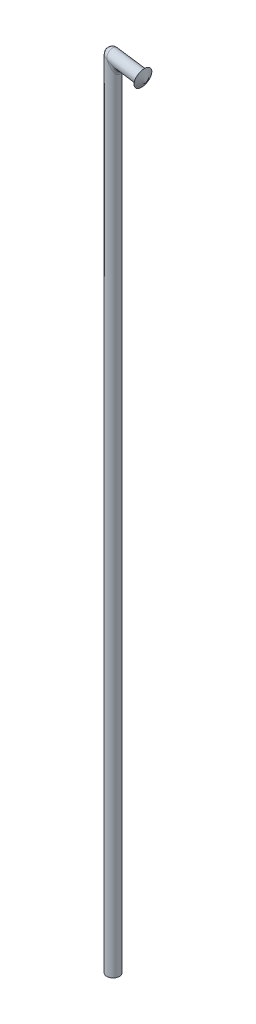
ISO-10303-21;
HEADER;
FILE_DESCRIPTION(('STEP AP214'),'2;1');
FILE_NAME('part.step','',(''),(''),'','','');
FILE_SCHEMA(('AUTOMOTIVE_DESIGN { 1 0 10303 214 1 1 1 1 }'));
ENDSEC;
DATA;
#1=APPLICATION_CONTEXT('core data for automotive mechanical design processes');
#2=APPLICATION_PROTOCOL_DEFINITION('international standard','automotive_design',2000,#1);
#3=PRODUCT_CONTEXT('',#1,'mechanical');
#4=PRODUCT('Part','Part','',(#3));
#5=PRODUCT_RELATED_PRODUCT_CATEGORY('part','',(#4));
#6=PRODUCT_DEFINITION_FORMATION('','',#4);
#7=PRODUCT_DEFINITION_CONTEXT('part definition',#1,'design');
#8=PRODUCT_DEFINITION('design','',#6,#7);
#9=PRODUCT_DEFINITION_SHAPE('','',#8);
#10=(LENGTH_UNIT() NAMED_UNIT(*) SI_UNIT(.MILLI.,.METRE.));
#11=(NAMED_UNIT(*) PLANE_ANGLE_UNIT() SI_UNIT($,.RADIAN.));
#12=(NAMED_UNIT(*) SI_UNIT($,.STERADIAN.) SOLID_ANGLE_UNIT());
#13=UNCERTAINTY_MEASURE_WITH_UNIT(LENGTH_MEASURE(1.E-05),#10,'distance_accuracy_value','');
#14=(GEOMETRIC_REPRESENTATION_CONTEXT(3) GLOBAL_UNCERTAINTY_ASSIGNED_CONTEXT((#13)) GLOBAL_UNIT_ASSIGNED_CONTEXT((#10,
#11,#12)) REPRESENTATION_CONTEXT('',''));
#15=CARTESIAN_POINT('',(0.,0.,0.));
#16=DIRECTION('',(0.,0.,1.));
#17=DIRECTION('',(1.,0.,0.));
#18=AXIS2_PLACEMENT_3D('',#15,#16,#17);
#19=CARTESIAN_POINT('',(0.,0.,0.));
#20=DIRECTION('',(0.,1.,0.));
#21=DIRECTION('',(0.,0.,1.));
#22=AXIS2_PLACEMENT_3D('',#19,#20,#21);
#23=PLANE('',#22);
#24=CARTESIAN_POINT('',(0.,0.,0.));
#25=DIRECTION('',(0.,1.,0.));
#26=DIRECTION('',(0.,0.,1.));
#27=AXIS2_PLACEMENT_3D('',#24,#25,#26);
#28=CIRCLE('',#27,1.25);
#29=CARTESIAN_POINT('',(0.,0.,1.25));
#30=VERTEX_POINT('',#29);
#31=EDGE_CURVE('E77',#30,#30,#28,.T.);
#32=ORIENTED_EDGE('',*,*,#31,.F.);
#33=EDGE_LOOP('',(#32));
#34=FACE_BOUND('',#33,.T.);
#35=ADVANCED_FACE('F34',(#34),#23,.F.);
#36=CARTESIAN_POINT('',(-3.25301670592734,158.483264783079,0.));
#37=DIRECTION('',(0.989144474800726,-0.146946275799004,0.));
#38=DIRECTION('',(0.146946275799004,0.989144474800726,0.));
#39=AXIS2_PLACEMENT_3D('',#36,#37,#38);
#40=CYLINDRICAL_SURFACE('',#39,1.25);
#41=CARTESIAN_POINT('',(0.,158.,0.));
#42=DIRECTION('',(-0.559916237478955,-0.828549218216643,0.));
#43=DIRECTION('',(-0.828549218216643,0.559916237478955,0.));
#44=AXIS2_PLACEMENT_3D('',#41,#42,#43);
#45=ELLIPSE('',#44,2.89294374202435,1.25);
#46=CARTESIAN_POINT('',(0.,158.,1.25));
#47=VERTEX_POINT('',#46);
#48=CARTESIAN_POINT('',(0.,158.,-1.25));
#49=VERTEX_POINT('',#48);
#50=EDGE_CURVE('E47',#47,#49,#45,.F.);
#51=ORIENTED_EDGE('',*,*,#50,.T.);
#52=CARTESIAN_POINT('',(0.,158.,0.));
#53=DIRECTION('',(-0.996769802296441,-0.0803116506486686,0.));
#54=DIRECTION('',(-0.0803116506486686,0.996769802296441,0.));
#55=AXIS2_PLACEMENT_3D('',#52,#53,#54);
#56=ELLIPSE('',#55,1.28317278213856,1.25);
#57=EDGE_CURVE('E11',#49,#47,#56,.F.);
#58=ORIENTED_EDGE('',*,*,#57,.T.);
#59=EDGE_LOOP('',(#51,#58));
#60=FACE_BOUND('',#59,.T.);
#61=CARTESIAN_POINT('',(5.93486684880435,157.118322345206,0.));
#62=DIRECTION('',(0.989144474800726,-0.146946275799004,0.));
#63=DIRECTION('',(0.,0.,1.));
#64=AXIS2_PLACEMENT_3D('',#61,#62,#63);
#65=CIRCLE('',#64,1.25);
#66=CARTESIAN_POINT('',(5.93486684880435,157.118322345206,1.25));
#67=VERTEX_POINT('',#66);
#68=EDGE_CURVE('E74',#67,#67,#65,.T.);
#69=ORIENTED_EDGE('',*,*,#68,.F.);
#70=EDGE_LOOP('',(#69));
#71=FACE_BOUND('',#70,.T.);
#72=ADVANCED_FACE('F95',(#60,#71),#40,.T.);
#73=CARTESIAN_POINT('',(0.,0.,0.));
#74=DIRECTION('',(0.,1.,0.));
#75=DIRECTION('',(0.,0.,1.));
#76=AXIS2_PLACEMENT_3D('',#73,#74,#75);
#77=CYLINDRICAL_SURFACE('',#76,1.25);
#78=ORIENTED_EDGE('',*,*,#31,.T.);
#79=EDGE_LOOP('',(#78));
#80=FACE_BOUND('',#79,.T.);
#81=CARTESIAN_POINT('',(0.,158.,0.));
#82=DIRECTION('',(-0.225911435777641,-0.974147844623641,0.));
#83=DIRECTION('',(-0.974147844623641,0.225911435777641,0.));
#84=AXIS2_PLACEMENT_3D('',#81,#82,#83);
#85=ELLIPSE('',#84,1.28317278213856,1.25);
#86=EDGE_CURVE('E81',#47,#49,#85,.T.);
#87=ORIENTED_EDGE('',*,*,#86,.T.);
#88=CARTESIAN_POINT('',(0.,158.,0.));
#89=DIRECTION('',(-0.901832487156376,-0.432085830720408,0.));
#90=DIRECTION('',(-0.432085830720408,0.901832487156376,0.));
#91=AXIS2_PLACEMENT_3D('',#88,#89,#90);
#92=ELLIPSE('',#91,2.89294374202436,1.25);
#93=EDGE_CURVE('E85',#49,#47,#92,.T.);
#94=ORIENTED_EDGE('',*,*,#93,.T.);
#95=EDGE_LOOP('',(#87,#94));
#96=FACE_BOUND('',#95,.T.);
#97=ADVANCED_FACE('F68',(#80,#96),#77,.T.);
#98=CARTESIAN_POINT('',(5.93486684880436,157.118322345206,0.));
#99=DIRECTION('',(-0.989144474800726,0.146946275799004,0.));
#100=DIRECTION('',(0.146946275799004,0.989144474800726,0.));
#101=AXIS2_PLACEMENT_3D('',#98,#99,#100);
#102=CONICAL_SURFACE('',#101,1.75,1.11701072127637);
#103=CARTESIAN_POINT('',(6.77913334033467,156.992898992124,0.));
#104=VERTEX_POINT('',#103);
#105=VERTEX_LOOP('',#104);
#106=FACE_BOUND('',#105,.T.);
#107=CARTESIAN_POINT('',(5.93486684880436,157.118322345206,0.));
#108=DIRECTION('',(0.989144474800726,-0.146946275799004,0.));
#109=DIRECTION('',(0.146946275799004,0.989144474800726,0.));
#110=AXIS2_PLACEMENT_3D('',#107,#108,#109);
#111=CIRCLE('',#110,1.75);
#112=CARTESIAN_POINT('',(6.19202283145261,158.849325176107,0.));
#113=VERTEX_POINT('',#112);
#114=EDGE_CURVE('E72',#113,#113,#111,.T.);
#115=ORIENTED_EDGE('',*,*,#114,.T.);
#116=EDGE_LOOP('',(#115));
#117=FACE_BOUND('',#116,.T.);
#118=ADVANCED_FACE('F64',(#106,#117),#102,.T.);
#119=CARTESIAN_POINT('',(5.93486684880436,157.118322345206,0.));
#120=DIRECTION('',(0.989144474800726,-0.146946275799004,0.));
#121=DIRECTION('',(0.146946275799004,0.989144474800726,0.));
#122=AXIS2_PLACEMENT_3D('',#119,#120,#121);
#123=PLANE('',#122);
#124=ORIENTED_EDGE('',*,*,#68,.T.);
#125=EDGE_LOOP('',(#124));
#126=FACE_BOUND('',#125,.T.);
#127=ORIENTED_EDGE('',*,*,#114,.F.);
#128=EDGE_LOOP('',(#127));
#129=FACE_BOUND('',#128,.T.);
#130=ADVANCED_FACE('F67',(#126,#129),#123,.F.);
#131=CARTESIAN_POINT('',(0.,158.,1.25));
#132=CARTESIAN_POINT('',(0.,158.,1.25));
#133=CARTESIAN_POINT('',(0.,158.,1.25));
#134=CARTESIAN_POINT('',(0.104400324718258,157.929448443469,1.24997107612937));
#135=CARTESIAN_POINT('',(0.0794285086284994,157.90789997368,1.25014001079576));
#136=CARTESIAN_POINT('',(0.0544444434217951,157.886365707153,1.24997107612937));
#137=CARTESIAN_POINT('',(0.208827498792407,157.858878742704,1.24644080412072));
#138=CARTESIAN_POINT('',(0.159126322551884,157.815487678815,1.24317276573243));
#139=CARTESIAN_POINT('',(0.108902888698869,157.772702190187,1.24644080412072));
#140=CARTESIAN_POINT('',(0.415885834754197,157.718953048658,1.23224097110224));
#141=CARTESIAN_POINT('',(0.315540882722161,157.634119737288,1.21591942247941));
#142=CARTESIAN_POINT('',(0.216883164504575,157.547330021581,1.23224097110225));
#143=CARTESIAN_POINT('',(0.518524578685259,157.64959193159,1.22164141255187));
#144=CARTESIAN_POINT('',(0.392777073477394,157.544561777252,1.1955880737431));
#145=CARTESIAN_POINT('',(0.270408949045182,157.435613117282,1.22164141255187));
#146=CARTESIAN_POINT('',(0.720258615830635,157.513264287358,1.19344812038553));
#147=CARTESIAN_POINT('',(0.541816075206538,157.37174604372,1.14222265332503));
#148=CARTESIAN_POINT('',(0.375612619639619,157.216036169452,1.19344812038554));
#149=CARTESIAN_POINT('',(0.819384058401899,157.446277385889,1.17599345183465));
#150=CARTESIAN_POINT('',(0.614137537055525,157.287886877095,1.10909785276448));
#151=CARTESIAN_POINT('',(0.427306228488977,157.108143309923,1.17599345183465));
#152=CARTESIAN_POINT('',(1.01236561014181,157.315864488287,1.13430880350714));
#153=CARTESIAN_POINT('',(0.75089750452109,157.129309096641,1.03156755079043));
#154=CARTESIAN_POINT('',(0.527945505268129,156.898092984662,1.13430880350714));
#155=CARTESIAN_POINT('',(1.10629136577172,157.252391426533,1.11028639866745));
#156=CARTESIAN_POINT('',(0.81584900058411,157.05399565314,0.987022258176043));
#157=CARTESIAN_POINT('',(0.576927493610042,156.795859712401,1.11028639866746));
#158=CARTESIAN_POINT('',(1.28722575902087,157.130119746744,1.05580958026122));
#159=CARTESIAN_POINT('',(0.93548295211182,156.91527606398,0.888781557543946));
#160=CARTESIAN_POINT('',(0.671284214845294,156.598922089036,1.05580958026122));
#161=CARTESIAN_POINT('',(1.37436173522085,157.071235075961,1.02562767961064));
#162=CARTESIAN_POINT('',(0.990662528478127,156.851293489922,0.834897841517969));
#163=CARTESIAN_POINT('',(0.716725354410954,156.504079136548,1.02562767961064));
#164=CARTESIAN_POINT('',(1.54016424289598,156.95918920805,0.959280630615562));
#165=CARTESIAN_POINT('',(1.08855783938767,156.737780585461,0.721137256906295));
#166=CARTESIAN_POINT('',(0.803190844558341,156.323611779165,0.959280630615563));
#167=CARTESIAN_POINT('',(1.61903540874468,156.905889723292,0.923445292986909));
#168=CARTESIAN_POINT('',(1.13173810252815,156.687711618532,0.661029945603848));
#169=CARTESIAN_POINT('',(0.844321911327041,156.237764640458,0.923445292986911));
#170=CARTESIAN_POINT('',(1.76687704755463,156.805981435015,0.846345850047249));
#171=CARTESIAN_POINT('',(1.20392163434624,156.604012386416,0.539277076836236));
#172=CARTESIAN_POINT('',(0.921420864431793,156.0768467494,0.846345850047254));
#173=CARTESIAN_POINT('',(1.83614761646596,156.759169832927,0.805453321668463));
#174=CARTESIAN_POINT('',(1.23333516861617,156.56990640448,0.477376880378002));
#175=CARTESIAN_POINT('',(0.957545249868968,156.001449358304,0.805453321668468));
#176=CARTESIAN_POINT('',(1.96350151845409,156.673106728815,0.718898011601016));
#177=CARTESIAN_POINT('',(1.27731339524191,156.518912172061,0.357963800295823));
#178=CARTESIAN_POINT('',(1.02395991218012,155.862831297175,0.718898011601019));
#179=CARTESIAN_POINT('',(2.02199062016289,156.633581016833,0.673621330461827));
#180=CARTESIAN_POINT('',(1.29221302104091,156.501635554988,0.3002036217166));
#181=CARTESIAN_POINT('',(1.05446179612895,155.79916896921,0.673621330461826));
#182=CARTESIAN_POINT('',(2.12666934277995,156.562841324823,0.579064001945823));
#183=CARTESIAN_POINT('',(1.30842960306577,156.482831882892,0.196064921809063));
#184=CARTESIAN_POINT('',(1.10905142318586,155.685231654812,0.579064001945824));
#185=CARTESIAN_POINT('',(2.1733598487689,156.531288857131,0.530142599095288));
#186=CARTESIAN_POINT('',(1.3099954657981,156.481016212406,0.149485202128771));
#187=CARTESIAN_POINT('',(1.13340037629985,155.634411481167,0.530142599095291));
#188=CARTESIAN_POINT('',(2.25354659126418,156.477100333182,0.42917589819806));
#189=CARTESIAN_POINT('',(1.30372855045977,156.488282911448,0.0740120022293973));
#190=CARTESIAN_POINT('',(1.17521751218275,155.547132406091,0.429175898198066));
#191=CARTESIAN_POINT('',(2.28758918246089,156.45409506185,0.377412279316827));
#192=CARTESIAN_POINT('',(1.29606644959177,156.497167375022,0.0449880864499099));
#193=CARTESIAN_POINT('',(1.19297061721707,155.510078826154,0.377412279316831));
#194=CARTESIAN_POINT('',(2.34186765458282,156.417414805303,0.271752838982435));
#195=CARTESIAN_POINT('',(1.27848090129978,156.517558409532,0.00661099186220525));
#196=CARTESIAN_POINT('',(1.22127667098117,155.450999548259,0.271752838982438));
#197=CARTESIAN_POINT('',(2.36259349644851,156.403408714728,0.218020725646717));
#198=CARTESIAN_POINT('',(1.26866925368533,156.528935344831,-0.00281612513470292));
#199=CARTESIAN_POINT('',(1.23208513281183,155.428440553444,0.218020725646719));
#200=CARTESIAN_POINT('',(2.38998417965047,156.384898663734,0.109493164717277));
#201=CARTESIAN_POINT('',(1.2543985504399,156.545482705057,-0.00813304110692254));
#202=CARTESIAN_POINT('',(1.24636928859293,155.398627227435,0.109493164717278));
#203=CARTESIAN_POINT('',(2.39694627579901,156.380193824727,0.0547465823586387));
#204=CARTESIAN_POINT('',(1.25,156.550582972181,-0.0040825631335063));
#205=CARTESIAN_POINT('',(1.25,155.391049349927,0.0547465823586391));
#206=CARTESIAN_POINT('',(2.39694627579901,156.380193824727,-0.0547465823586384));
#207=CARTESIAN_POINT('',(1.25,156.550582972181,0.00408256313350628));
#208=CARTESIAN_POINT('',(1.25,155.391049349927,-0.0547465823586388));
#209=CARTESIAN_POINT('',(2.38998417965047,156.384898663734,-0.109493164717277));
#210=CARTESIAN_POINT('',(1.2543985504399,156.545482705057,0.00813304110692248));
#211=CARTESIAN_POINT('',(1.24636928859293,155.398627227435,-0.109493164717278));
#212=CARTESIAN_POINT('',(2.36259349644851,156.403408714728,-0.218020725646716));
#213=CARTESIAN_POINT('',(1.26866925368533,156.528935344831,0.00281612513470286));
#214=CARTESIAN_POINT('',(1.23208513281183,155.428440553444,-0.218020725646719));
#215=CARTESIAN_POINT('',(2.34186765458282,156.417414805303,-0.271752838982435));
#216=CARTESIAN_POINT('',(1.27848090129978,156.517558409532,-0.00661099186220527));
#217=CARTESIAN_POINT('',(1.22127667098117,155.450999548259,-0.271752838982438));
#218=CARTESIAN_POINT('',(2.28758918246089,156.45409506185,-0.377412279316826));
#219=CARTESIAN_POINT('',(1.29606644959177,156.497167375022,-0.0449880864499099));
#220=CARTESIAN_POINT('',(1.19297061721707,155.510078826154,-0.377412279316831));
#221=CARTESIAN_POINT('',(2.25354659126418,156.477100333182,-0.42917589819806));
#222=CARTESIAN_POINT('',(1.30372855045977,156.488282911448,-0.0740120022293973));
#223=CARTESIAN_POINT('',(1.17521751218275,155.547132406091,-0.429175898198065));
#224=CARTESIAN_POINT('',(2.1733598487689,156.531288857131,-0.530142599095288));
#225=CARTESIAN_POINT('',(1.3099954657981,156.481016212406,-0.14948520212877));
#226=CARTESIAN_POINT('',(1.13340037629985,155.634411481167,-0.530142599095291));
#227=CARTESIAN_POINT('',(2.12666934277995,156.562841324823,-0.579064001945823));
#228=CARTESIAN_POINT('',(1.30842960306577,156.482831882892,-0.196064921809063));
#229=CARTESIAN_POINT('',(1.10905142318586,155.685231654812,-0.579064001945823));
#230=CARTESIAN_POINT('',(2.02199062016289,156.633581016833,-0.673621330461827));
#231=CARTESIAN_POINT('',(1.2922130210409,156.501635554988,-0.3002036217166));
#232=CARTESIAN_POINT('',(1.05446179612895,155.79916896921,-0.673621330461826));
#233=CARTESIAN_POINT('',(1.96350151845409,156.673106728815,-0.718898011601016));
#234=CARTESIAN_POINT('',(1.27731339524191,156.518912172061,-0.357963800295824));
#235=CARTESIAN_POINT('',(1.02395991218012,155.862831297175,-0.718898011601019));
#236=CARTESIAN_POINT('',(1.83614761646596,156.759169832927,-0.805453321668463));
#237=CARTESIAN_POINT('',(1.23333516861617,156.56990640448,-0.477376880378));
#238=CARTESIAN_POINT('',(0.957545249868969,156.001449358304,-0.805453321668467));
#239=CARTESIAN_POINT('',(1.76687704755463,156.805981435015,-0.84634585004725));
#240=CARTESIAN_POINT('',(1.20392163434625,156.604012386416,-0.539277076836233));
#241=CARTESIAN_POINT('',(0.921420864431794,156.0768467494,-0.846345850047252));
#242=CARTESIAN_POINT('',(1.61903540874468,156.905889723292,-0.923445292986906));
#243=CARTESIAN_POINT('',(1.13173810252815,156.687711618532,-0.661029945603847));
#244=CARTESIAN_POINT('',(0.844321911327042,156.237764640458,-0.92344529298691));
#245=CARTESIAN_POINT('',(1.54016424289598,156.95918920805,-0.959280630615556));
#246=CARTESIAN_POINT('',(1.08855783938767,156.737780585461,-0.721137256906298));
#247=CARTESIAN_POINT('',(0.803190844558339,156.323611779165,-0.959280630615563));
#248=CARTESIAN_POINT('',(1.37436173522085,157.071235075961,-1.02562767961064));
#249=CARTESIAN_POINT('',(0.990662528478125,156.851293489922,-0.834897841517972));
#250=CARTESIAN_POINT('',(0.716725354410952,156.504079136548,-1.02562767961064));
#251=CARTESIAN_POINT('',(1.28722575902087,157.130119746744,-1.05580958026122));
#252=CARTESIAN_POINT('',(0.935482952111822,156.91527606398,-0.888781557543946));
#253=CARTESIAN_POINT('',(0.671284214845295,156.598922089036,-1.05580958026122));
#254=CARTESIAN_POINT('',(1.10629136577172,157.252391426533,-1.11028639866745));
#255=CARTESIAN_POINT('',(0.815849000584114,157.05399565314,-0.98702225817604));
#256=CARTESIAN_POINT('',(0.576927493610044,156.795859712401,-1.11028639866745));
#257=CARTESIAN_POINT('',(1.01236561014181,157.315864488287,-1.13430880350714));
#258=CARTESIAN_POINT('',(0.750897504521091,157.129309096641,-1.03156755079043));
#259=CARTESIAN_POINT('',(0.52794550526813,156.898092984662,-1.13430880350714));
#260=CARTESIAN_POINT('',(0.819384058401898,157.446277385889,-1.17599345183465));
#261=CARTESIAN_POINT('',(0.614137537055524,157.287886877095,-1.10909785276448));
#262=CARTESIAN_POINT('',(0.427306228488976,157.108143309923,-1.17599345183465));
#263=CARTESIAN_POINT('',(0.720258615830635,157.513264287358,-1.19344812038553));
#264=CARTESIAN_POINT('',(0.541816075206537,157.37174604372,-1.14222265332503));
#265=CARTESIAN_POINT('',(0.375612619639618,157.216036169452,-1.19344812038554));
#266=CARTESIAN_POINT('',(0.518524578685259,157.64959193159,-1.22164141255187));
#267=CARTESIAN_POINT('',(0.392777073477394,157.544561777252,-1.1955880737431));
#268=CARTESIAN_POINT('',(0.270408949045182,157.435613117282,-1.22164141255187));
#269=CARTESIAN_POINT('',(0.415885834754197,157.718953048658,-1.23224097110224));
#270=CARTESIAN_POINT('',(0.315540882722161,157.634119737288,-1.21591942247941));
#271=CARTESIAN_POINT('',(0.216883164504575,157.547330021581,-1.23224097110225));
#272=CARTESIAN_POINT('',(0.208827498792407,157.858878742704,-1.24644080412072));
#273=CARTESIAN_POINT('',(0.159126322551884,157.815487678815,-1.24317276573243));
#274=CARTESIAN_POINT('',(0.108902888698869,157.772702190187,-1.24644080412072));
#275=CARTESIAN_POINT('',(0.104400324718258,157.929448443469,-1.24997107612937));
#276=CARTESIAN_POINT('',(0.0794285086284997,157.90789997368,-1.25014001079576));
#277=CARTESIAN_POINT('',(0.0544444434217952,157.886365707153,-1.24997107612937));
#278=CARTESIAN_POINT('',(0.,158.,-1.25));
#279=CARTESIAN_POINT('',(0.,158.,-1.25));
#280=CARTESIAN_POINT('',(0.,158.,-1.25));
#281=(BOUNDED_SURFACE() B_SPLINE_SURFACE(3,2,((#131,#132,#133),(#134,#135,#136),(#137,#138,
#139),(#140,#141,#142),(#143,#144,#145),(#146,#147,#148),(#149,#150,#151),(#152,#153,#154),
(#155,#156,#157),(#158,#159,#160),(#161,#162,#163),(#164,#165,#166),(#167,#168,#169),(#170,#171,
#172),(#173,#174,#175),(#176,#177,#178),(#179,#180,#181),(#182,#183,#184),(#185,#186,#187),
(#188,#189,#190),(#191,#192,#193),(#194,#195,#196),(#197,#198,#199),(#200,#201,#202),(#203,#204,
#205),(#206,#207,#208),(#209,#210,#211),(#212,#213,#214),(#215,#216,#217),(#218,#219,#220),
(#221,#222,#223),(#224,#225,#226),(#227,#228,#229),(#230,#231,#232),(#233,#234,#235),(#236,#237,
#238),(#239,#240,#241),(#242,#243,#244),(#245,#246,#247),(#248,#249,#250),(#251,#252,#253),
(#254,#255,#256),(#257,#258,#259),(#260,#261,#262),(#263,#264,#265),(#266,#267,#268),(#269,#270,
#271),(#272,#273,#274),(#275,#276,#277),(#278,#279,#280)),.UNSPECIFIED.,.F.,.F.,
.F.) B_SPLINE_SURFACE_WITH_KNOTS((4,2,2,2,2,2,2,2,2,2,2,2,2,2,2,2,2,2,2,2,2,2,2,2,4),(3,3),(0.,
0.45009533907688,0.895798577277972,1.33289196151035,1.75751125311282,2.16633475735369,
2.55678723354672,2.92726211280149,3.27735940599911,3.60812099615602,3.92221357133787,
4.22396412358453,4.51912333158145,4.81428253957838,5.11603309182503,5.43012566700689,
5.76088725716379,6.11098455036142,6.48145942961619,6.8719119058092,7.28073541005009,
7.70535470165256,8.14244808588494,8.58815132408603,9.03824666316291),(0.,1.),
.UNSPECIFIED.) GEOMETRIC_REPRESENTATION_ITEM() RATIONAL_B_SPLINE_SURFACE(((1.,1.,1.),(1.,
1.00000111855193,1.),(1.,0.998367995911656,1.),(1.,0.991869572156315,1.),(1.,0.98703596665407,
1.),(1.,0.974296665500654,1.),(1.,0.966452118553167,1.),(1.,0.947990466132553,1.),(1.,
0.93745887504013,1.),(1.,0.914072377671645,1.),(1.,0.901318472389497,1.),(1.,0.874104280472637,
1.),(1.,0.859746425980727,1.),(1.,0.830129635928036,1.),(1.,0.814954391576011,1.),(1.,
0.784713553253099,1.),(1.,0.769687839804372,1.),(1.,0.740956111117604,1.),(1.,0.727223042510415,
1.),(1.,0.702417885215849,1.),(1.,0.691246572617073,1.),(1.,0.672855519453705,1.),(1.,
0.665497753852191,1.),(1.,0.655666706522365,1.),(1.,0.653090240395995,1.),(1.,0.653090240395995,
1.),(1.,0.655666706522365,1.),(1.,0.665497753852191,1.),(1.,0.672855519453705,1.),(1.,
0.691246572617073,1.),(1.,0.702417885215849,1.),(1.,0.727223042510415,1.),(1.,0.740956111117604,
1.),(1.,0.769687839804372,1.),(1.,0.784713553253099,1.),(1.,0.814954391576011,1.),(1.,
0.830129635928036,1.),(1.,0.859746425980726,1.),(1.,0.874104280472635,1.),(1.,0.901318472389496,
1.),(1.,0.914072377671644,1.),(1.,0.93745887504013,1.),(1.,0.947990466132553,1.),(1.,
0.966452118553166,1.),(1.,0.974296665500654,1.),(1.,0.98703596665407,1.),(1.,0.991869572156315,
1.),(1.,0.998367995911656,1.),(1.,1.00000111855193,1.),(1.,1.,1.))) REPRESENTATION_ITEM('') SURFACE());
#282=ORIENTED_EDGE('',*,*,#93,.F.);
#283=ORIENTED_EDGE('',*,*,#50,.F.);
#284=EDGE_LOOP('',(#282,#283));
#285=FACE_BOUND('',#284,.T.);
#286=ADVANCED_FACE('F89',(#285),#281,.F.);
#287=CARTESIAN_POINT('',(0.,158.,-1.25));
#288=CARTESIAN_POINT('',(0.,158.,-1.25));
#289=CARTESIAN_POINT('',(0.,158.,-1.25));
#290=CARTESIAN_POINT('',(-0.0544444434217553,158.012626032538,-1.24997107612938));
#291=CARTESIAN_POINT('',(-0.0294749049279115,158.034177143277,-1.24995512064507));
#292=CARTESIAN_POINT('',(-0.00448856212532908,158.055708768854,-1.24997107612936));
#293=CARTESIAN_POINT('',(-0.108902888698841,158.025255312201,-1.24644080412073));
#294=CARTESIAN_POINT('',(-0.059038719187556,158.068457379913,-1.24970309052566));
#295=CARTESIAN_POINT('',(-0.00897827860532992,158.111431864718,-1.24644080412073));
#296=CARTESIAN_POINT('',(-0.216883164504572,158.050296664269,-1.23224097110224));
#297=CARTESIAN_POINT('',(-0.118571341726574,158.137487457368,-1.24847567610794));
#298=CARTESIAN_POINT('',(-0.0178804942549613,158.221919691346,-1.23224097110226));
#299=CARTESIAN_POINT('',(-0.270408949045191,158.062709653635,-1.22164141255187));
#300=CARTESIAN_POINT('',(-0.148732819593372,158.172460705051,-1.24749865777671));
#301=CARTESIAN_POINT('',(-0.0222933194051195,158.276688467943,-1.22164141255189));
#302=CARTESIAN_POINT('',(-0.37561261963962,158.087107092283,-1.19344812038554));
#303=CARTESIAN_POINT('',(-0.210083825634591,158.243599259315,-1.24450336470326));
#304=CARTESIAN_POINT('',(-0.0309666234486138,158.384335210189,-1.19344812038556));
#305=CARTESIAN_POINT('',(-0.427306228488958,158.099095187786,-1.17599345183466));
#306=CARTESIAN_POINT('',(-0.241465684757212,158.279987580097,-1.24248212613389));
#307=CARTESIAN_POINT('',(-0.0352283985760576,158.437229263753,-1.17599345183466));
#308=CARTESIAN_POINT('',(-0.527945505268106,158.122434112815,-1.13430880350715));
#309=CARTESIAN_POINT('',(-0.305943801829511,158.354752124742,-1.23665302955229));
#310=CARTESIAN_POINT('',(-0.0435254003944452,158.540205616441,-1.13430880350715));
#311=CARTESIAN_POINT('',(-0.576927493610033,158.133793365289,-1.11028639866746));
#312=CARTESIAN_POINT('',(-0.339229840004168,158.393348405157,-1.23284366072866));
#313=CARTESIAN_POINT('',(-0.0475636214483752,158.590325079421,-1.11028639866749));
#314=CARTESIAN_POINT('',(-0.6712842148453,158.15567532344,-1.05580958026122));
#315=CARTESIAN_POINT('',(-0.408245362768967,158.47337422426,-1.22216822721772));
#316=CARTESIAN_POINT('',(-0.0553426706697308,158.686872981148,-1.05580958026128));
#317=CARTESIAN_POINT('',(-0.716725354410962,158.166213429272,-1.02562767961063));
#318=CARTESIAN_POINT('',(-0.444156974247877,158.515014945199,-1.21530749508096));
#319=CARTESIAN_POINT('',(-0.0590889736010723,158.733369368684,-1.02562767961071));
#320=CARTESIAN_POINT('',(-0.803190844558339,158.18626535787,-0.959280630615566));
#321=CARTESIAN_POINT('',(-0.519105988813667,158.601920847543,-1.19643990668866));
#322=CARTESIAN_POINT('',(-0.0662174462207099,158.821842786755,-0.959280630615622));
#323=CARTESIAN_POINT('',(-0.844321911327027,158.195803928838,-0.923445292986927));
#324=CARTESIAN_POINT('',(-0.558307643989751,158.647376484768,-1.18445756195806));
#325=CARTESIAN_POINT('',(-0.0696084139094061,158.863929011672,-0.923445292986948));
#326=CARTESIAN_POINT('',(-0.921420864431781,158.213683694511,-0.846345850047263));
#327=CARTESIAN_POINT('',(-0.640220908533721,158.742357669115,-1.15211492678367));
#328=CARTESIAN_POINT('',(-0.0759646813089589,158.942818380126,-0.846345850047281));
#329=CARTESIAN_POINT('',(-0.957545249868969,158.222061182411,-0.805453321668463));
#330=CARTESIAN_POINT('',(-0.683061301982766,158.79203254571,-1.13182394324483));
#331=CARTESIAN_POINT('',(-0.0789428832719791,158.979781657034,-0.805453321668509));
#332=CARTESIAN_POINT('',(-1.02395991218013,158.237463189203,-0.718898011601016));
#333=CARTESIAN_POINT('',(-0.771811800756129,158.89494173303,-1.07826504960402));
#334=CARTESIAN_POINT('',(-0.0844183059061508,159.047738620843,-0.718898011601065));
#335=CARTESIAN_POINT('',(-1.05446179612894,158.244536781199,-0.673621330461835));
#336=CARTESIAN_POINT('',(-0.817789043845792,158.948253892251,-1.04516162375402));
#337=CARTESIAN_POINT('',(-0.086932972095007,159.078948828822,-0.673621330461862));
#338=CARTESIAN_POINT('',(-1.10905142318586,158.257196482799,-0.579064001945834));
#339=CARTESIAN_POINT('',(-0.910671507406098,159.055954231667,-0.960343107895395));
#340=CARTESIAN_POINT('',(-0.0914335035917723,159.13480615281,-0.579064001945847));
#341=CARTESIAN_POINT('',(-1.13340037629985,158.262843168759,-0.530142599095293));
#342=CARTESIAN_POINT('',(-0.957552068297485,159.110313818251,-0.908977798985475));
#343=CARTESIAN_POINT('',(-0.0934409038308067,159.159720544722,-0.530142599095315));
#344=CARTESIAN_POINT('',(-1.17521751218275,158.272540843768,-0.429175898198065));
#345=CARTESIAN_POINT('',(-1.04741084062847,159.214508086023,-0.782657898544378));
#346=CARTESIAN_POINT('',(-0.0968884331013278,159.202508770859,-0.429175898198088));
#347=CARTESIAN_POINT('',(-1.19297061721707,158.276657908205,-0.377412279316834));
#348=CARTESIAN_POINT('',(-1.09025782112042,159.264190600515,-0.708373407551058));
#349=CARTESIAN_POINT('',(-0.0983520519732618,159.220674143901,-0.377412279316852));
#350=CARTESIAN_POINT('',(-1.22127667098117,158.283222272416,-0.271752838982441));
#351=CARTESIAN_POINT('',(-1.1644525769865,159.350221914537,-0.535508583823317));
#352=CARTESIAN_POINT('',(-0.10068568737952,159.249637529459,-0.271752838982454));
#353=CARTESIAN_POINT('',(-1.23208513281183,158.285728827395,-0.218020725646719));
#354=CARTESIAN_POINT('',(-1.19560050953539,159.386338989591,-0.438053942301316));
#355=CARTESIAN_POINT('',(-0.101576769175147,159.260696988679,-0.218020725646731));
#356=CARTESIAN_POINT('',(-1.24636928859293,158.289041419174,-0.109493164717276));
#357=CARTESIAN_POINT('',(-1.23845305444952,159.436027956218,-0.22630794665652));
#358=CARTESIAN_POINT('',(-0.102754397535395,159.275312855472,-0.109493164717285));
#359=CARTESIAN_POINT('',(-1.25,158.289883405564,-0.0547465823586382));
#360=CARTESIAN_POINT('',(-1.25,159.449417027818,-0.113600370106702));
#361=CARTESIAN_POINT('',(-0.103053724200993,159.279027880364,-0.0547465823586423));
#362=CARTESIAN_POINT('',(-1.25,158.289883405564,0.0547465823586381));
#363=CARTESIAN_POINT('',(-1.25,159.449417027818,0.113600370106702));
#364=CARTESIAN_POINT('',(-0.103053724200993,159.279027880364,0.0547465823586422));
#365=CARTESIAN_POINT('',(-1.24636928859293,158.289041419174,0.109493164717276));
#366=CARTESIAN_POINT('',(-1.23845305444952,159.436027956218,0.22630794665652));
#367=CARTESIAN_POINT('',(-0.102754397535396,159.275312855472,0.109493164717284));
#368=CARTESIAN_POINT('',(-1.23208513281183,158.285728827395,0.218020725646718));
#369=CARTESIAN_POINT('',(-1.19560050953539,159.386338989591,0.438053942301315));
#370=CARTESIAN_POINT('',(-0.101576769175147,159.260696988679,0.218020725646731));
#371=CARTESIAN_POINT('',(-1.22127667098117,158.283222272416,0.27175283898244));
#372=CARTESIAN_POINT('',(-1.1644525769865,159.350221914537,0.535508583823316));
#373=CARTESIAN_POINT('',(-0.10068568737952,159.249637529459,0.271752838982453));
#374=CARTESIAN_POINT('',(-1.19297061721707,158.276657908205,0.377412279316833));
#375=CARTESIAN_POINT('',(-1.09025782112042,159.264190600515,0.708373407551057));
#376=CARTESIAN_POINT('',(-0.0983520519732618,159.220674143901,0.377412279316851));
#377=CARTESIAN_POINT('',(-1.17521751218275,158.272540843768,0.429175898198064));
#378=CARTESIAN_POINT('',(-1.04741084062847,159.214508086023,0.782657898544378));
#379=CARTESIAN_POINT('',(-0.0968884331013278,159.202508770859,0.429175898198088));
#380=CARTESIAN_POINT('',(-1.13340037629985,158.262843168759,0.530142599095293));
#381=CARTESIAN_POINT('',(-0.957552068297485,159.110313818251,0.908977798985475));
#382=CARTESIAN_POINT('',(-0.0934409038308067,159.159720544722,0.530142599095315));
#383=CARTESIAN_POINT('',(-1.10905142318586,158.257196482799,0.579064001945833));
#384=CARTESIAN_POINT('',(-0.910671507406098,159.055954231667,0.960343107895394));
#385=CARTESIAN_POINT('',(-0.0914335035917722,159.13480615281,0.579064001945847));
#386=CARTESIAN_POINT('',(-1.05446179612895,158.244536781199,0.673621330461835));
#387=CARTESIAN_POINT('',(-0.817789043845792,158.948253892251,1.04516162375402));
#388=CARTESIAN_POINT('',(-0.086932972095007,159.078948828822,0.673621330461861));
#389=CARTESIAN_POINT('',(-1.02395991218013,158.237463189203,0.718898011601015));
#390=CARTESIAN_POINT('',(-0.771811800756129,158.89494173303,1.07826504960402));
#391=CARTESIAN_POINT('',(-0.0844183059061508,159.047738620843,0.718898011601065));
#392=CARTESIAN_POINT('',(-0.957545249868969,158.222061182411,0.805453321668462));
#393=CARTESIAN_POINT('',(-0.683061301982767,158.79203254571,1.13182394324483));
#394=CARTESIAN_POINT('',(-0.0789428832719791,158.979781657034,0.805453321668509));
#395=CARTESIAN_POINT('',(-0.921420864431781,158.213683694511,0.846345850047263));
#396=CARTESIAN_POINT('',(-0.640220908533721,158.742357669115,1.15211492678367));
#397=CARTESIAN_POINT('',(-0.0759646813089589,158.942818380126,0.846345850047281));
#398=CARTESIAN_POINT('',(-0.844321911327028,158.195803928838,0.923445292986927));
#399=CARTESIAN_POINT('',(-0.558307643989752,158.647376484768,1.18445756195806));
#400=CARTESIAN_POINT('',(-0.0696084139094062,158.863929011672,0.923445292986948));
#401=CARTESIAN_POINT('',(-0.80319084455834,158.18626535787,0.959280630615566));
#402=CARTESIAN_POINT('',(-0.519105988813668,158.601920847543,1.19643990668866));
#403=CARTESIAN_POINT('',(-0.0662174462207101,158.821842786755,0.959280630615621));
#404=CARTESIAN_POINT('',(-0.716725354410963,158.166213429272,1.02562767961063));
#405=CARTESIAN_POINT('',(-0.444156974247878,158.515014945199,1.21530749508096));
#406=CARTESIAN_POINT('',(-0.0590889736010725,158.733369368684,1.02562767961071));
#407=CARTESIAN_POINT('',(-0.671284214845301,158.15567532344,1.05580958026122));
#408=CARTESIAN_POINT('',(-0.408245362768967,158.47337422426,1.22216822721772));
#409=CARTESIAN_POINT('',(-0.0553426706697308,158.686872981148,1.05580958026128));
#410=CARTESIAN_POINT('',(-0.576927493610033,158.133793365289,1.11028639866746));
#411=CARTESIAN_POINT('',(-0.339229840004168,158.393348405157,1.23284366072866));
#412=CARTESIAN_POINT('',(-0.0475636214483752,158.590325079421,1.11028639866749));
#413=CARTESIAN_POINT('',(-0.527945505268107,158.122434112815,1.13430880350715));
#414=CARTESIAN_POINT('',(-0.305943801829512,158.354752124742,1.23665302955229));
#415=CARTESIAN_POINT('',(-0.0435254003944453,158.540205616441,1.13430880350715));
#416=CARTESIAN_POINT('',(-0.427306228488959,158.099095187786,1.17599345183466));
#417=CARTESIAN_POINT('',(-0.241465684757213,158.279987580097,1.24248212613389));
#418=CARTESIAN_POINT('',(-0.0352283985760578,158.437229263753,1.17599345183466));
#419=CARTESIAN_POINT('',(-0.37561261963962,158.087107092283,1.19344812038554));
#420=CARTESIAN_POINT('',(-0.210083825634592,158.243599259315,1.24450336470326));
#421=CARTESIAN_POINT('',(-0.030966623448614,158.384335210189,1.19344812038556));
#422=CARTESIAN_POINT('',(-0.270408949045191,158.062709653635,1.22164141255187));
#423=CARTESIAN_POINT('',(-0.148732819593372,158.172460705051,1.24749865777671));
#424=CARTESIAN_POINT('',(-0.0222933194051195,158.276688467943,1.22164141255189));
#425=CARTESIAN_POINT('',(-0.216883164504573,158.050296664269,1.23224097110224));
#426=CARTESIAN_POINT('',(-0.118571341726575,158.137487457368,1.24847567610794));
#427=CARTESIAN_POINT('',(-0.0178804942549614,158.221919691346,1.23224097110226));
#428=CARTESIAN_POINT('',(-0.108902888698842,158.025255312201,1.24644080412073));
#429=CARTESIAN_POINT('',(-0.0590387191875564,158.068457379913,1.24970309052566));
#430=CARTESIAN_POINT('',(-0.00897827860533004,158.111431864718,1.24644080412073));
#431=CARTESIAN_POINT('',(-0.0544444434217558,158.012626032538,1.24997107612938));
#432=CARTESIAN_POINT('',(-0.029474904927912,158.034177143277,1.24995512064507));
#433=CARTESIAN_POINT('',(-0.0044885621253292,158.055708768854,1.24997107612936));
#434=CARTESIAN_POINT('',(0.,158.,1.25));
#435=CARTESIAN_POINT('',(0.,158.,1.25));
#436=CARTESIAN_POINT('',(0.,158.,1.25));
#437=(BOUNDED_SURFACE() B_SPLINE_SURFACE(3,2,((#287,#288,#289),(#290,#291,#292),(#293,#294,
#295),(#296,#297,#298),(#299,#300,#301),(#302,#303,#304),(#305,#306,#307),(#308,#309,#310),
(#311,#312,#313),(#314,#315,#316),(#317,#318,#319),(#320,#321,#322),(#323,#324,#325),(#326,#327,
#328),(#329,#330,#331),(#332,#333,#334),(#335,#336,#337),(#338,#339,#340),(#341,#342,#343),
(#344,#345,#346),(#347,#348,#349),(#350,#351,#352),(#353,#354,#355),(#356,#357,#358),(#359,#360,
#361),(#362,#363,#364),(#365,#366,#367),(#368,#369,#370),(#371,#372,#373),(#374,#375,#376),
(#377,#378,#379),(#380,#381,#382),(#383,#384,#385),(#386,#387,#388),(#389,#390,#391),(#392,#393,
#394),(#395,#396,#397),(#398,#399,#400),(#401,#402,#403),(#404,#405,#406),(#407,#408,#409),
(#410,#411,#412),(#413,#414,#415),(#416,#417,#418),(#419,#420,#421),(#422,#423,#424),(#425,#426,
#427),(#428,#429,#430),(#431,#432,#433),(#434,#435,#436)),.UNSPECIFIED.,.F.,.F.,
.F.) B_SPLINE_SURFACE_WITH_KNOTS((4,2,2,2,2,2,2,2,2,2,2,2,2,2,2,2,2,2,2,2,2,2,2,2,4),(3,3),(0.,
0.0500105932307691,0.0995331752531034,0.148099106834493,0.195279028123642,0.24070386192818,
0.284087470394084,0.325251345866829,0.364151045111015,0.400902332906224,0.43580150792643,
0.469329347064947,0.502124814620162,0.534920282175377,0.568448121313893,0.6033472963341,
0.640098584129308,0.678998283373495,0.72016215884624,0.763545767312144,0.808970601116682,
0.856150522405831,0.90471645398722,0.954239036009555,1.00424962924032),(0.,1.),
.UNSPECIFIED.) GEOMETRIC_REPRESENTATION_ITEM() RATIONAL_B_SPLINE_SURFACE(((1.,1.,1.),(1.,
1.00000111855193,1.),(1.,0.998367995911657,1.),(1.,0.991869572156318,1.),(1.,0.987035966654075,
1.),(1.,0.97429666550066,1.),(1.,0.966452118553172,1.),(1.,0.94799046613256,1.),(1.,
0.937458875040141,1.),(1.,0.914072377671658,1.),(1.,0.90131847238951,1.),(1.,0.874104280472648,
1.),(1.,0.859746425980738,1.),(1.,0.830129635928045,1.),(1.,0.814954391576019,1.),(1.,
0.784713553253106,1.),(1.,0.769687839804379,1.),(1.,0.740956111117609,1.),(1.,0.727223042510419,
1.),(1.,0.702417885215852,1.),(1.,0.691246572617076,1.),(1.,0.672855519453707,1.),(1.,
0.665497753852193,1.),(1.,0.655666706522366,1.),(1.,0.653090240395994,1.),(1.,0.653090240395994,
1.),(1.,0.655666706522366,1.),(1.,0.665497753852193,1.),(1.,0.672855519453707,1.),(1.,
0.691246572617076,1.),(1.,0.702417885215852,1.),(1.,0.727223042510419,1.),(1.,0.740956111117609,
1.),(1.,0.769687839804379,1.),(1.,0.784713553253106,1.),(1.,0.814954391576019,1.),(1.,
0.830129635928045,1.),(1.,0.859746425980738,1.),(1.,0.874104280472648,1.),(1.,0.90131847238951,
1.),(1.,0.914072377671658,1.),(1.,0.937458875040141,1.),(1.,0.94799046613256,1.),(1.,
0.966452118553172,1.),(1.,0.97429666550066,1.),(1.,0.987035966654074,1.),(1.,0.991869572156318,
1.),(1.,0.998367995911657,1.),(1.,1.00000111855193,1.),(1.,1.,1.))) REPRESENTATION_ITEM('') SURFACE());
#438=ORIENTED_EDGE('',*,*,#86,.F.);
#439=ORIENTED_EDGE('',*,*,#57,.F.);
#440=EDGE_LOOP('',(#438,#439));
#441=FACE_BOUND('',#440,.T.);
#442=ADVANCED_FACE('F36',(#441),#437,.T.);
#443=CLOSED_SHELL('',(#35,#72,#97,#118,#130,#286,#442));
#444=MANIFOLD_SOLID_BREP('B2',#443);
#445=ADVANCED_BREP_SHAPE_REPRESENTATION('',(#18,#444),#14);
#446=SHAPE_DEFINITION_REPRESENTATION(#9,#445);
ENDSEC;
END-ISO-10303-21;
